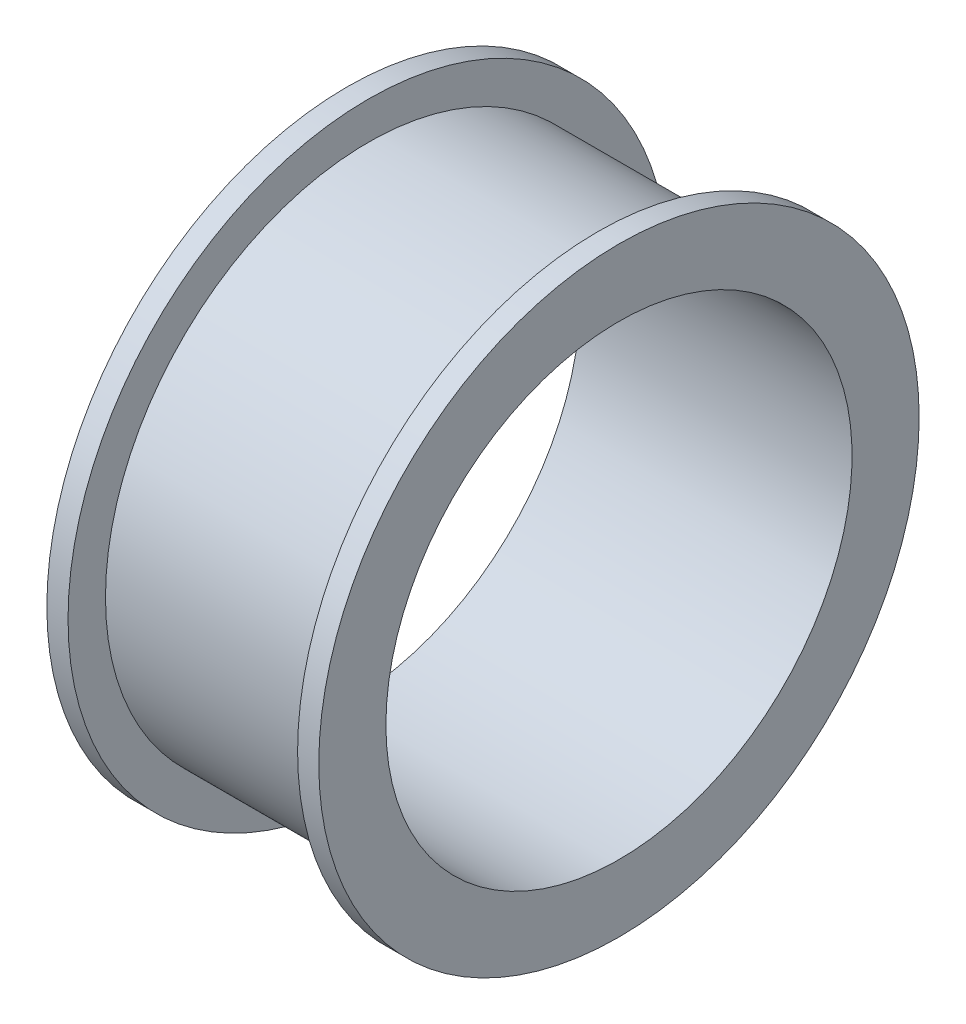
ISO-10303-21;
HEADER;
FILE_DESCRIPTION(('STEP AP214'),'2;1');
FILE_NAME('part.step','',(''),(''),'','','');
FILE_SCHEMA(('AUTOMOTIVE_DESIGN { 1 0 10303 214 1 1 1 1 }'));
ENDSEC;
DATA;
#1=APPLICATION_CONTEXT('core data for automotive mechanical design processes');
#2=APPLICATION_PROTOCOL_DEFINITION('international standard','automotive_design',2000,#1);
#3=PRODUCT_CONTEXT('',#1,'mechanical');
#4=PRODUCT('Part','Part','',(#3));
#5=PRODUCT_RELATED_PRODUCT_CATEGORY('part','',(#4));
#6=PRODUCT_DEFINITION_FORMATION('','',#4);
#7=PRODUCT_DEFINITION_CONTEXT('part definition',#1,'design');
#8=PRODUCT_DEFINITION('design','',#6,#7);
#9=PRODUCT_DEFINITION_SHAPE('','',#8);
#10=(LENGTH_UNIT() NAMED_UNIT(*) SI_UNIT(.MILLI.,.METRE.));
#11=(NAMED_UNIT(*) PLANE_ANGLE_UNIT() SI_UNIT($,.RADIAN.));
#12=(NAMED_UNIT(*) SI_UNIT($,.STERADIAN.) SOLID_ANGLE_UNIT());
#13=UNCERTAINTY_MEASURE_WITH_UNIT(LENGTH_MEASURE(1.E-05),#10,'distance_accuracy_value','');
#14=(GEOMETRIC_REPRESENTATION_CONTEXT(3) GLOBAL_UNCERTAINTY_ASSIGNED_CONTEXT((#13)) GLOBAL_UNIT_ASSIGNED_CONTEXT((#10,
#11,#12)) REPRESENTATION_CONTEXT('',''));
#15=CARTESIAN_POINT('',(0.,0.,0.));
#16=DIRECTION('',(0.,0.,1.));
#17=DIRECTION('',(1.,0.,0.));
#18=AXIS2_PLACEMENT_3D('',#15,#16,#17);
#19=CARTESIAN_POINT('',(3.25,0.,0.));
#20=DIRECTION('',(-1.,0.,0.));
#21=DIRECTION('',(0.,0.,1.));
#22=AXIS2_PLACEMENT_3D('',#19,#20,#21);
#23=CYLINDRICAL_SURFACE('',#22,7.44);
#24=CARTESIAN_POINT('',(3.25,0.,0.));
#25=DIRECTION('',(1.,0.,0.));
#26=DIRECTION('',(0.,0.,-1.));
#27=AXIS2_PLACEMENT_3D('',#24,#25,#26);
#28=CIRCLE('',#27,7.44);
#29=CARTESIAN_POINT('',(3.25,0.,7.44));
#30=VERTEX_POINT('',#29);
#31=EDGE_CURVE('E10',#30,#30,#28,.T.);
#32=CARTESIAN_POINT('',(-3.25,0.,0.));
#33=DIRECTION('',(-1.,0.,0.));
#34=DIRECTION('',(0.,0.,1.));
#35=AXIS2_PLACEMENT_3D('',#32,#33,#34);
#36=CIRCLE('',#35,7.44);
#37=CARTESIAN_POINT('',(-3.25,0.,7.44));
#38=VERTEX_POINT('',#37);
#39=EDGE_CURVE('E45',#38,#38,#36,.T.);
#40=CARTESIAN_POINT('',(3.25,0.,7.44));
#41=CARTESIAN_POINT('',(3.18229166666667,0.,7.44));
#42=CARTESIAN_POINT('',(3.11458333333333,0.,7.44));
#43=CARTESIAN_POINT('',(2.97916666666667,0.,7.44));
#44=CARTESIAN_POINT('',(2.91145833333333,0.,7.44));
#45=CARTESIAN_POINT('',(2.77604166666667,0.,7.44));
#46=CARTESIAN_POINT('',(2.70833333333333,0.,7.44));
#47=CARTESIAN_POINT('',(2.57291666666667,0.,7.44));
#48=CARTESIAN_POINT('',(2.50520833333333,0.,7.44));
#49=CARTESIAN_POINT('',(2.36979166666667,0.,7.44));
#50=CARTESIAN_POINT('',(2.30208333333333,0.,7.44));
#51=CARTESIAN_POINT('',(2.16666666666667,0.,7.44));
#52=CARTESIAN_POINT('',(2.09895833333333,0.,7.44));
#53=CARTESIAN_POINT('',(1.96354166666667,0.,7.44));
#54=CARTESIAN_POINT('',(1.89583333333333,0.,7.44));
#55=CARTESIAN_POINT('',(1.76041666666667,0.,7.44));
#56=CARTESIAN_POINT('',(1.69270833333333,0.,7.44));
#57=CARTESIAN_POINT('',(1.55729166666667,0.,7.44));
#58=CARTESIAN_POINT('',(1.48958333333333,0.,7.44));
#59=CARTESIAN_POINT('',(1.35416666666667,0.,7.44));
#60=CARTESIAN_POINT('',(1.28645833333333,0.,7.44));
#61=CARTESIAN_POINT('',(1.15104166666667,0.,7.44));
#62=CARTESIAN_POINT('',(1.08333333333333,0.,7.44));
#63=CARTESIAN_POINT('',(0.947916666666666,0.,7.44));
#64=CARTESIAN_POINT('',(0.880208333333333,0.,7.44));
#65=CARTESIAN_POINT('',(0.744791666666666,0.,7.44));
#66=CARTESIAN_POINT('',(0.677083333333333,0.,7.44));
#67=CARTESIAN_POINT('',(0.541666666666666,0.,7.44));
#68=CARTESIAN_POINT('',(0.473958333333333,0.,7.44));
#69=CARTESIAN_POINT('',(0.338541666666666,0.,7.44));
#70=CARTESIAN_POINT('',(0.270833333333333,0.,7.44));
#71=CARTESIAN_POINT('',(0.135416666666666,0.,7.44));
#72=CARTESIAN_POINT('',(0.0677083333333329,0.,7.44));
#73=CARTESIAN_POINT('',(-0.0677083333333338,0.,7.44));
#74=CARTESIAN_POINT('',(-0.135416666666667,0.,7.44));
#75=CARTESIAN_POINT('',(-0.270833333333334,0.,7.44));
#76=CARTESIAN_POINT('',(-0.338541666666667,0.,7.44));
#77=CARTESIAN_POINT('',(-0.473958333333334,0.,7.44));
#78=CARTESIAN_POINT('',(-0.541666666666667,0.,7.44));
#79=CARTESIAN_POINT('',(-0.677083333333333,0.,7.44));
#80=CARTESIAN_POINT('',(-0.744791666666667,0.,7.44));
#81=CARTESIAN_POINT('',(-0.880208333333333,0.,7.44));
#82=CARTESIAN_POINT('',(-0.947916666666666,0.,7.44));
#83=CARTESIAN_POINT('',(-1.08333333333333,0.,7.44));
#84=CARTESIAN_POINT('',(-1.15104166666667,0.,7.44));
#85=CARTESIAN_POINT('',(-1.28645833333333,0.,7.44));
#86=CARTESIAN_POINT('',(-1.35416666666667,0.,7.44));
#87=CARTESIAN_POINT('',(-1.48958333333333,0.,7.44));
#88=CARTESIAN_POINT('',(-1.55729166666667,0.,7.44));
#89=CARTESIAN_POINT('',(-1.69270833333333,0.,7.44));
#90=CARTESIAN_POINT('',(-1.76041666666667,0.,7.44));
#91=CARTESIAN_POINT('',(-1.89583333333333,0.,7.44));
#92=CARTESIAN_POINT('',(-1.96354166666667,0.,7.44));
#93=CARTESIAN_POINT('',(-2.09895833333333,0.,7.44));
#94=CARTESIAN_POINT('',(-2.16666666666667,0.,7.44));
#95=CARTESIAN_POINT('',(-2.30208333333333,0.,7.44));
#96=CARTESIAN_POINT('',(-2.36979166666667,0.,7.44));
#97=CARTESIAN_POINT('',(-2.50520833333333,0.,7.44));
#98=CARTESIAN_POINT('',(-2.57291666666667,0.,7.44));
#99=CARTESIAN_POINT('',(-2.70833333333333,0.,7.44));
#100=CARTESIAN_POINT('',(-2.77604166666667,0.,7.44));
#101=CARTESIAN_POINT('',(-2.91145833333333,0.,7.44));
#102=CARTESIAN_POINT('',(-2.97916666666667,0.,7.44));
#103=CARTESIAN_POINT('',(-3.11458333333333,0.,7.44));
#104=CARTESIAN_POINT('',(-3.18229166666667,0.,7.44));
#105=CARTESIAN_POINT('',(-3.25,0.,7.44));
#106=B_SPLINE_CURVE_WITH_KNOTS('',3,(#40,#41,#42,#43,#44,#45,#46,#47,#48,#49,#50,#51,#52,#53,
#54,#55,#56,#57,#58,#59,#60,#61,#62,#63,#64,#65,#66,#67,#68,#69,#70,#71,#72,#73,#74,#75,#76,#77,
#78,#79,#80,#81,#82,#83,#84,#85,#86,#87,#88,#89,#90,#91,#92,#93,#94,#95,#96,#97,#98,#99,#100,
#101,#102,#103,#104,#105),.UNSPECIFIED.,.F.,.F.,(4,2,2,2,2,2,2,2,2,2,2,2,2,2,2,2,2,2,2,2,2,2,2,
2,2,2,2,2,2,2,2,2,4),(0.,0.203125,0.40625,0.609375,0.8125,1.015625,1.21875,1.421875,1.625,
1.828125,2.03125,2.234375,2.4375,2.640625,2.84375,3.046875,3.25,3.453125,3.65625,3.859375,
4.0625,4.265625,4.46875,4.671875,4.875,5.078125,5.28125,5.484375,5.6875,5.890625,6.09375,
6.296875,6.5),.UNSPECIFIED.);
#107=EDGE_CURVE('BSEAM30',#30,#38,#106,.T.);
#108=ORIENTED_EDGE('',*,*,#31,.F.);
#109=ORIENTED_EDGE('',*,*,#39,.F.);
#110=ORIENTED_EDGE('',*,*,#107,.T.);
#111=ORIENTED_EDGE('',*,*,#107,.F.);
#112=EDGE_LOOP('',(#108,#110,#109,#111));
#113=FACE_BOUND('',#112,.T.);
#114=ADVANCED_FACE('F30',(#113),#23,.T.);
#115=CARTESIAN_POINT('',(3.85,0.,0.));
#116=DIRECTION('',(-1.,0.,0.));
#117=DIRECTION('',(0.,0.,1.));
#118=AXIS2_PLACEMENT_3D('',#115,#116,#117);
#119=CYLINDRICAL_SURFACE('',#118,8.5);
#120=CARTESIAN_POINT('',(3.85,0.,0.));
#121=DIRECTION('',(1.,0.,0.));
#122=DIRECTION('',(0.,0.,-1.));
#123=AXIS2_PLACEMENT_3D('',#120,#121,#122);
#124=CIRCLE('',#123,8.5);
#125=CARTESIAN_POINT('',(3.85,0.,-8.5));
#126=VERTEX_POINT('',#125);
#127=EDGE_CURVE('E36',#126,#126,#124,.T.);
#128=ORIENTED_EDGE('',*,*,#127,.F.);
#129=EDGE_LOOP('',(#128));
#130=FACE_BOUND('',#129,.T.);
#131=CARTESIAN_POINT('',(3.25,0.,0.));
#132=DIRECTION('',(1.,0.,0.));
#133=DIRECTION('',(0.,0.,-1.));
#134=AXIS2_PLACEMENT_3D('',#131,#132,#133);
#135=CIRCLE('',#134,8.5);
#136=CARTESIAN_POINT('',(3.25,0.,-8.5));
#137=VERTEX_POINT('',#136);
#138=EDGE_CURVE('E40',#137,#137,#135,.T.);
#139=ORIENTED_EDGE('',*,*,#138,.T.);
#140=EDGE_LOOP('',(#139));
#141=FACE_BOUND('',#140,.T.);
#142=ADVANCED_FACE('F76',(#130,#141),#119,.T.);
#143=CARTESIAN_POINT('',(3.85,0.,0.));
#144=DIRECTION('',(1.,0.,0.));
#145=DIRECTION('',(0.,0.,-1.));
#146=AXIS2_PLACEMENT_3D('',#143,#144,#145);
#147=PLANE('',#146);
#148=CARTESIAN_POINT('',(3.85,0.,0.));
#149=DIRECTION('',(1.,0.,0.));
#150=DIRECTION('',(0.,0.,-1.));
#151=AXIS2_PLACEMENT_3D('',#148,#149,#150);
#152=CIRCLE('',#151,6.6);
#153=CARTESIAN_POINT('',(3.85,0.,6.6));
#154=VERTEX_POINT('',#153);
#155=EDGE_CURVE('E56',#154,#154,#152,.T.);
#156=ORIENTED_EDGE('',*,*,#155,.F.);
#157=EDGE_LOOP('',(#156));
#158=FACE_BOUND('',#157,.T.);
#159=ORIENTED_EDGE('',*,*,#127,.T.);
#160=EDGE_LOOP('',(#159));
#161=FACE_BOUND('',#160,.T.);
#162=ADVANCED_FACE('F81',(#158,#161),#147,.T.);
#163=CARTESIAN_POINT('',(3.25,0.,0.));
#164=DIRECTION('',(1.,0.,0.));
#165=DIRECTION('',(0.,0.,-1.));
#166=AXIS2_PLACEMENT_3D('',#163,#164,#165);
#167=PLANE('',#166);
#168=ORIENTED_EDGE('',*,*,#31,.T.);
#169=EDGE_LOOP('',(#168));
#170=FACE_BOUND('',#169,.T.);
#171=ORIENTED_EDGE('',*,*,#138,.F.);
#172=EDGE_LOOP('',(#171));
#173=FACE_BOUND('',#172,.T.);
#174=ADVANCED_FACE('F90',(#170,#173),#167,.F.);
#175=CARTESIAN_POINT('',(-3.85,0.,0.));
#176=DIRECTION('',(1.,0.,0.));
#177=DIRECTION('',(0.,0.,-1.));
#178=AXIS2_PLACEMENT_3D('',#175,#176,#177);
#179=CYLINDRICAL_SURFACE('',#178,8.5);
#180=CARTESIAN_POINT('',(-3.85,0.,0.));
#181=DIRECTION('',(1.,0.,0.));
#182=DIRECTION('',(0.,0.,-1.));
#183=AXIS2_PLACEMENT_3D('',#180,#181,#182);
#184=CIRCLE('',#183,8.5);
#185=CARTESIAN_POINT('',(-3.85,0.,-8.5));
#186=VERTEX_POINT('',#185);
#187=EDGE_CURVE('E49',#186,#186,#184,.T.);
#188=ORIENTED_EDGE('',*,*,#187,.T.);
#189=EDGE_LOOP('',(#188));
#190=FACE_BOUND('',#189,.T.);
#191=CARTESIAN_POINT('',(-3.25,0.,0.));
#192=DIRECTION('',(1.,0.,0.));
#193=DIRECTION('',(0.,0.,-1.));
#194=AXIS2_PLACEMENT_3D('',#191,#192,#193);
#195=CIRCLE('',#194,8.5);
#196=CARTESIAN_POINT('',(-3.25,0.,-8.5));
#197=VERTEX_POINT('',#196);
#198=EDGE_CURVE('E50',#197,#197,#195,.T.);
#199=ORIENTED_EDGE('',*,*,#198,.F.);
#200=EDGE_LOOP('',(#199));
#201=FACE_BOUND('',#200,.T.);
#202=ADVANCED_FACE('F88',(#190,#201),#179,.T.);
#203=CARTESIAN_POINT('',(-3.85,0.,0.));
#204=DIRECTION('',(-1.,0.,0.));
#205=DIRECTION('',(0.,0.,-1.));
#206=AXIS2_PLACEMENT_3D('',#203,#204,#205);
#207=PLANE('',#206);
#208=CARTESIAN_POINT('',(-3.85,0.,0.));
#209=DIRECTION('',(1.,0.,0.));
#210=DIRECTION('',(0.,0.,-1.));
#211=AXIS2_PLACEMENT_3D('',#208,#209,#210);
#212=CIRCLE('',#211,6.6);
#213=CARTESIAN_POINT('',(-3.85,0.,6.6));
#214=VERTEX_POINT('',#213);
#215=EDGE_CURVE('E53',#214,#214,#212,.T.);
#216=ORIENTED_EDGE('',*,*,#215,.T.);
#217=EDGE_LOOP('',(#216));
#218=FACE_BOUND('',#217,.T.);
#219=ORIENTED_EDGE('',*,*,#187,.F.);
#220=EDGE_LOOP('',(#219));
#221=FACE_BOUND('',#220,.T.);
#222=ADVANCED_FACE('F62',(#218,#221),#207,.T.);
#223=CARTESIAN_POINT('',(-3.25,0.,0.));
#224=DIRECTION('',(-1.,0.,0.));
#225=DIRECTION('',(0.,0.,-1.));
#226=AXIS2_PLACEMENT_3D('',#223,#224,#225);
#227=PLANE('',#226);
#228=ORIENTED_EDGE('',*,*,#39,.T.);
#229=EDGE_LOOP('',(#228));
#230=FACE_BOUND('',#229,.T.);
#231=ORIENTED_EDGE('',*,*,#198,.T.);
#232=EDGE_LOOP('',(#231));
#233=FACE_BOUND('',#232,.T.);
#234=ADVANCED_FACE('F67',(#230,#233),#227,.F.);
#235=CARTESIAN_POINT('',(3.25,0.,0.));
#236=DIRECTION('',(-1.,0.,0.));
#237=DIRECTION('',(0.,0.,1.));
#238=AXIS2_PLACEMENT_3D('',#235,#236,#237);
#239=CYLINDRICAL_SURFACE('',#238,6.6);
#240=CARTESIAN_POINT('',(3.85,0.,6.6));
#241=CARTESIAN_POINT('',(3.76979166666667,0.,6.6));
#242=CARTESIAN_POINT('',(3.68958333333333,0.,6.6));
#243=CARTESIAN_POINT('',(3.52916666666667,0.,6.6));
#244=CARTESIAN_POINT('',(3.44895833333333,0.,6.6));
#245=CARTESIAN_POINT('',(3.28854166666667,0.,6.6));
#246=CARTESIAN_POINT('',(3.20833333333333,0.,6.6));
#247=CARTESIAN_POINT('',(3.04791666666667,0.,6.6));
#248=CARTESIAN_POINT('',(2.96770833333333,0.,6.6));
#249=CARTESIAN_POINT('',(2.80729166666667,0.,6.6));
#250=CARTESIAN_POINT('',(2.72708333333333,0.,6.6));
#251=CARTESIAN_POINT('',(2.56666666666667,0.,6.6));
#252=CARTESIAN_POINT('',(2.48645833333333,0.,6.6));
#253=CARTESIAN_POINT('',(2.32604166666667,0.,6.6));
#254=CARTESIAN_POINT('',(2.24583333333333,0.,6.6));
#255=CARTESIAN_POINT('',(2.08541666666667,0.,6.6));
#256=CARTESIAN_POINT('',(2.00520833333333,0.,6.6));
#257=CARTESIAN_POINT('',(1.84479166666667,0.,6.6));
#258=CARTESIAN_POINT('',(1.76458333333333,0.,6.6));
#259=CARTESIAN_POINT('',(1.60416666666667,0.,6.6));
#260=CARTESIAN_POINT('',(1.52395833333333,0.,6.6));
#261=CARTESIAN_POINT('',(1.36354166666667,0.,6.6));
#262=CARTESIAN_POINT('',(1.28333333333333,0.,6.6));
#263=CARTESIAN_POINT('',(1.12291666666667,0.,6.6));
#264=CARTESIAN_POINT('',(1.04270833333333,0.,6.6));
#265=CARTESIAN_POINT('',(0.882291666666667,0.,6.6));
#266=CARTESIAN_POINT('',(0.802083333333333,0.,6.6));
#267=CARTESIAN_POINT('',(0.641666666666667,0.,6.6));
#268=CARTESIAN_POINT('',(0.561458333333333,0.,6.6));
#269=CARTESIAN_POINT('',(0.401041666666667,0.,6.6));
#270=CARTESIAN_POINT('',(0.320833333333333,0.,6.6));
#271=CARTESIAN_POINT('',(0.160416666666667,0.,6.6));
#272=CARTESIAN_POINT('',(0.0802083333333333,0.,6.6));
#273=CARTESIAN_POINT('',(-0.0802083333333335,0.,6.6));
#274=CARTESIAN_POINT('',(-0.160416666666667,0.,6.6));
#275=CARTESIAN_POINT('',(-0.320833333333334,0.,6.6));
#276=CARTESIAN_POINT('',(-0.401041666666667,0.,6.6));
#277=CARTESIAN_POINT('',(-0.561458333333333,0.,6.6));
#278=CARTESIAN_POINT('',(-0.641666666666667,0.,6.6));
#279=CARTESIAN_POINT('',(-0.802083333333333,0.,6.6));
#280=CARTESIAN_POINT('',(-0.882291666666666,0.,6.6));
#281=CARTESIAN_POINT('',(-1.04270833333333,0.,6.6));
#282=CARTESIAN_POINT('',(-1.12291666666667,0.,6.6));
#283=CARTESIAN_POINT('',(-1.28333333333333,0.,6.6));
#284=CARTESIAN_POINT('',(-1.36354166666667,0.,6.6));
#285=CARTESIAN_POINT('',(-1.52395833333333,0.,6.6));
#286=CARTESIAN_POINT('',(-1.60416666666667,0.,6.6));
#287=CARTESIAN_POINT('',(-1.76458333333333,0.,6.6));
#288=CARTESIAN_POINT('',(-1.84479166666667,0.,6.6));
#289=CARTESIAN_POINT('',(-2.00520833333333,0.,6.6));
#290=CARTESIAN_POINT('',(-2.08541666666667,0.,6.6));
#291=CARTESIAN_POINT('',(-2.24583333333333,0.,6.6));
#292=CARTESIAN_POINT('',(-2.32604166666667,0.,6.6));
#293=CARTESIAN_POINT('',(-2.48645833333333,0.,6.6));
#294=CARTESIAN_POINT('',(-2.56666666666667,0.,6.6));
#295=CARTESIAN_POINT('',(-2.72708333333333,0.,6.6));
#296=CARTESIAN_POINT('',(-2.80729166666667,0.,6.6));
#297=CARTESIAN_POINT('',(-2.96770833333333,0.,6.6));
#298=CARTESIAN_POINT('',(-3.04791666666667,0.,6.6));
#299=CARTESIAN_POINT('',(-3.20833333333333,0.,6.6));
#300=CARTESIAN_POINT('',(-3.28854166666667,0.,6.6));
#301=CARTESIAN_POINT('',(-3.44895833333333,0.,6.6));
#302=CARTESIAN_POINT('',(-3.52916666666667,0.,6.6));
#303=CARTESIAN_POINT('',(-3.68958333333333,0.,6.6));
#304=CARTESIAN_POINT('',(-3.76979166666667,0.,6.6));
#305=CARTESIAN_POINT('',(-3.85,0.,6.6));
#306=B_SPLINE_CURVE_WITH_KNOTS('',3,(#240,#241,#242,#243,#244,#245,#246,#247,#248,#249,#250,
#251,#252,#253,#254,#255,#256,#257,#258,#259,#260,#261,#262,#263,#264,#265,#266,#267,#268,#269,
#270,#271,#272,#273,#274,#275,#276,#277,#278,#279,#280,#281,#282,#283,#284,#285,#286,#287,#288,
#289,#290,#291,#292,#293,#294,#295,#296,#297,#298,#299,#300,#301,#302,#303,#304,#305),
.UNSPECIFIED.,.F.,.F.,(4,2,2,2,2,2,2,2,2,2,2,2,2,2,2,2,2,2,2,2,2,2,2,2,2,2,2,2,2,2,2,2,4),(0.,
0.240625,0.48125,0.721875,0.9625,1.203125,1.44375,1.684375,1.925,2.165625,2.40625,2.646875,
2.8875,3.128125,3.36875,3.609375,3.85,4.090625,4.33125,4.571875,4.8125,5.053125,5.29375,
5.534375,5.775,6.015625,6.25625,6.496875,6.7375,6.978125,7.21875,7.459375,7.7),.UNSPECIFIED.);
#307=EDGE_CURVE('BSEAM65',#154,#214,#306,.T.);
#308=ORIENTED_EDGE('',*,*,#155,.T.);
#309=ORIENTED_EDGE('',*,*,#215,.F.);
#310=ORIENTED_EDGE('',*,*,#307,.T.);
#311=ORIENTED_EDGE('',*,*,#307,.F.);
#312=EDGE_LOOP('',(#308,#310,#309,#311));
#313=FACE_BOUND('',#312,.T.);
#314=ADVANCED_FACE('F65',(#313),#239,.F.);
#315=CLOSED_SHELL('',(#114,#142,#162,#174,#202,#222,#234,#314));
#316=MANIFOLD_SOLID_BREP('B2',#315);
#317=ADVANCED_BREP_SHAPE_REPRESENTATION('',(#18,#316),#14);
#318=SHAPE_DEFINITION_REPRESENTATION(#9,#317);
ENDSEC;
END-ISO-10303-21;
